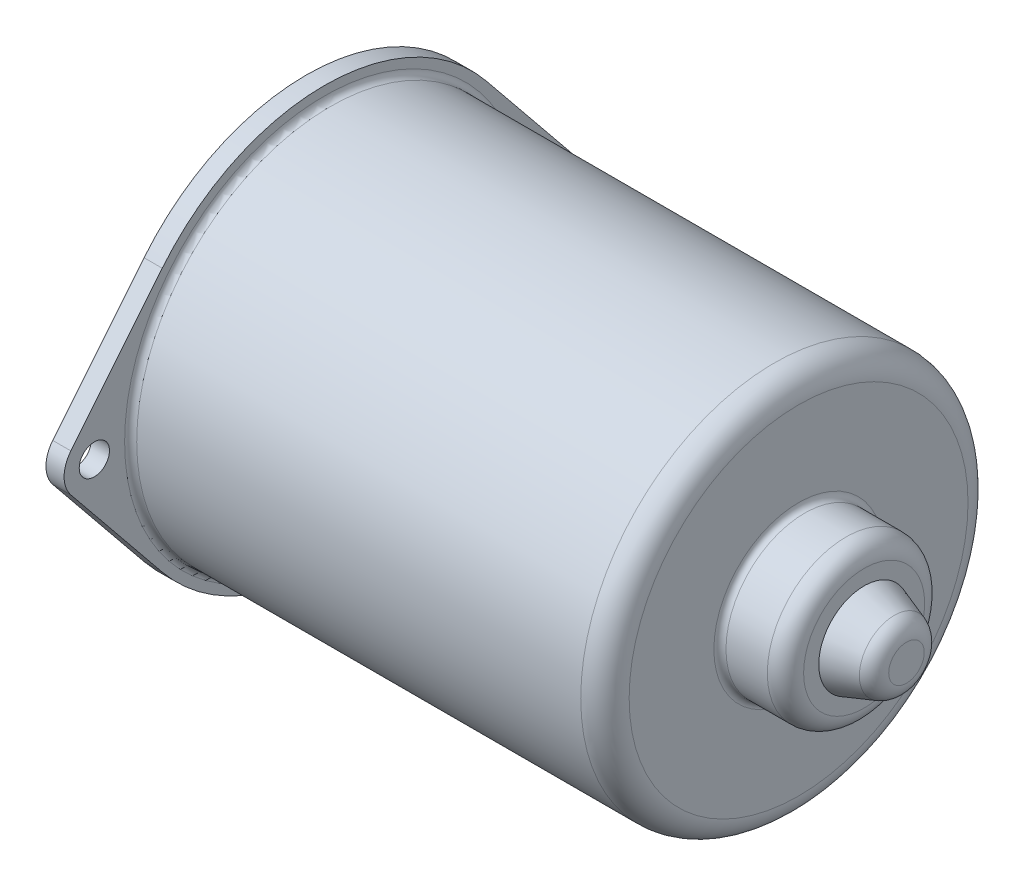
ISO-10303-21;
HEADER;
FILE_DESCRIPTION(('STEP AP214'),'2;1');
FILE_NAME('part.step','',(''),(''),'','','');
FILE_SCHEMA(('AUTOMOTIVE_DESIGN { 1 0 10303 214 1 1 1 1 }'));
ENDSEC;
DATA;
#1=APPLICATION_CONTEXT('core data for automotive mechanical design processes');
#2=APPLICATION_PROTOCOL_DEFINITION('international standard','automotive_design',2000,#1);
#3=PRODUCT_CONTEXT('',#1,'mechanical');
#4=PRODUCT('Part','Part','',(#3));
#5=PRODUCT_RELATED_PRODUCT_CATEGORY('part','',(#4));
#6=PRODUCT_DEFINITION_FORMATION('','',#4);
#7=PRODUCT_DEFINITION_CONTEXT('part definition',#1,'design');
#8=PRODUCT_DEFINITION('design','',#6,#7);
#9=PRODUCT_DEFINITION_SHAPE('','',#8);
#10=(LENGTH_UNIT() NAMED_UNIT(*) SI_UNIT(.MILLI.,.METRE.));
#11=(NAMED_UNIT(*) PLANE_ANGLE_UNIT() SI_UNIT($,.RADIAN.));
#12=(NAMED_UNIT(*) SI_UNIT($,.STERADIAN.) SOLID_ANGLE_UNIT());
#13=UNCERTAINTY_MEASURE_WITH_UNIT(LENGTH_MEASURE(1.E-05),#10,'distance_accuracy_value','');
#14=(GEOMETRIC_REPRESENTATION_CONTEXT(3) GLOBAL_UNCERTAINTY_ASSIGNED_CONTEXT((#13)) GLOBAL_UNIT_ASSIGNED_CONTEXT((#10,
#11,#12)) REPRESENTATION_CONTEXT('',''));
#15=CARTESIAN_POINT('',(0.,0.,0.));
#16=DIRECTION('',(0.,0.,1.));
#17=DIRECTION('',(1.,0.,0.));
#18=AXIS2_PLACEMENT_3D('',#15,#16,#17);
#19=CARTESIAN_POINT('',(-40.8415641656417,45.,0.));
#20=DIRECTION('',(-1.,0.,0.));
#21=DIRECTION('',(0.,0.,1.));
#22=AXIS2_PLACEMENT_3D('',#19,#20,#21);
#23=PLANE('',#22);
#24=CARTESIAN_POINT('',(-40.8415641656417,0.,-38.));
#25=DIRECTION('',(-1.,0.,0.));
#26=DIRECTION('',(0.,0.,1.));
#27=AXIS2_PLACEMENT_3D('',#24,#25,#26);
#28=CIRCLE('',#27,2.5);
#29=CARTESIAN_POINT('',(-40.8415641656417,0.,-35.5));
#30=VERTEX_POINT('',#29);
#31=EDGE_CURVE('E291',#30,#30,#28,.T.);
#32=ORIENTED_EDGE('',*,*,#31,.T.);
#33=EDGE_LOOP('',(#32));
#34=FACE_BOUND('',#33,.T.);
#35=CARTESIAN_POINT('',(-40.8415641656417,0.,38.));
#36=DIRECTION('',(-1.,0.,0.));
#37=DIRECTION('',(0.,0.,1.));
#38=AXIS2_PLACEMENT_3D('',#35,#36,#37);
#39=CIRCLE('',#38,2.5);
#40=CARTESIAN_POINT('',(-40.8415641656417,0.,40.5));
#41=VERTEX_POINT('',#40);
#42=EDGE_CURVE('E295',#41,#41,#39,.T.);
#43=ORIENTED_EDGE('',*,*,#42,.T.);
#44=EDGE_LOOP('',(#43));
#45=FACE_BOUND('',#44,.T.);
#46=CARTESIAN_POINT('',(-40.8415641656417,0.,0.));
#47=DIRECTION('',(-1.,0.,0.));
#48=DIRECTION('',(0.,0.,1.));
#49=AXIS2_PLACEMENT_3D('',#46,#47,#48);
#50=CIRCLE('',#49,33.);
#51=CARTESIAN_POINT('',(-40.8415641656417,0.,33.));
#52=VERTEX_POINT('',#51);
#53=EDGE_CURVE('E11',#52,#52,#50,.T.);
#54=ORIENTED_EDGE('',*,*,#53,.T.);
#55=EDGE_LOOP('',(#54));
#56=FACE_BOUND('',#55,.T.);
#57=CARTESIAN_POINT('',(-40.8415641656417,0.,0.));
#58=DIRECTION('',(-1.,0.,0.));
#59=DIRECTION('',(0.,0.,1.));
#60=AXIS2_PLACEMENT_3D('',#57,#58,#59);
#61=CIRCLE('',#60,34.5);
#62=CARTESIAN_POINT('',(-40.8415641656417,21.7468744769274,26.7828947368421));
#63=VERTEX_POINT('',#62);
#64=CARTESIAN_POINT('',(-40.8415641656417,21.7468744769274,-26.7828947368421));
#65=VERTEX_POINT('',#64);
#66=EDGE_CURVE('E160',#63,#65,#61,.T.);
#67=ORIENTED_EDGE('',*,*,#66,.F.);
#68=DIRECTION('',(0.,0.776315789473684,-0.630344187737025));
#69=VECTOR('',#68,1.);
#70=CARTESIAN_POINT('',(-40.8415641656417,48.8668537013041,4.76231817839733));
#71=LINE('',#70,#69);
#72=CARTESIAN_POINT('',(-40.8415641656417,3.15172093868512,41.8815789473684));
#73=VERTEX_POINT('',#72);
#74=EDGE_CURVE('E158',#73,#63,#71,.T.);
#75=ORIENTED_EDGE('',*,*,#74,.F.);
#76=CARTESIAN_POINT('',(-40.8415641656417,0.,38.));
#77=DIRECTION('',(-1.,0.,0.));
#78=DIRECTION('',(0.,0.,1.));
#79=AXIS2_PLACEMENT_3D('',#76,#77,#78);
#80=CIRCLE('',#79,4.99999999999999);
#81=CARTESIAN_POINT('',(-40.8415641656417,-3.15172093868513,41.8815789473684));
#82=VERTEX_POINT('',#81);
#83=EDGE_CURVE('E156',#82,#73,#80,.T.);
#84=ORIENTED_EDGE('',*,*,#83,.F.);
#85=DIRECTION('',(0.,0.776315789473684,0.630344187737025));
#86=VECTOR('',#85,1.);
#87=CARTESIAN_POINT('',(-40.8415641656417,5.37310474744936,48.8034712952869));
#88=LINE('',#87,#86);
#89=CARTESIAN_POINT('',(-40.8415641656417,-21.7468744769274,26.7828947368421));
#90=VERTEX_POINT('',#89);
#91=EDGE_CURVE('E154',#90,#82,#88,.T.);
#92=ORIENTED_EDGE('',*,*,#91,.F.);
#93=CARTESIAN_POINT('',(-40.8415641656417,0.,0.));
#94=DIRECTION('',(-1.,0.,0.));
#95=DIRECTION('',(0.,0.,1.));
#96=AXIS2_PLACEMENT_3D('',#93,#94,#95);
#97=CIRCLE('',#96,34.5);
#98=CARTESIAN_POINT('',(-40.8415641656417,-21.7468744769274,-26.7828947368421));
#99=VERTEX_POINT('',#98);
#100=EDGE_CURVE('E152',#99,#90,#97,.T.);
#101=ORIENTED_EDGE('',*,*,#100,.F.);
#102=DIRECTION('',(0.,-0.776315789473684,0.630344187737025));
#103=VECTOR('',#102,1.);
#104=CARTESIAN_POINT('',(-40.8415641656417,5.37310474744936,-48.8034712952869));
#105=LINE('',#104,#103);
#106=CARTESIAN_POINT('',(-40.8415641656417,-3.15172093868513,-41.8815789473684));
#107=VERTEX_POINT('',#106);
#108=EDGE_CURVE('E150',#107,#99,#105,.T.);
#109=ORIENTED_EDGE('',*,*,#108,.F.);
#110=CARTESIAN_POINT('',(-40.8415641656417,0.,-38.));
#111=DIRECTION('',(-1.,0.,0.));
#112=DIRECTION('',(0.,0.,1.));
#113=AXIS2_PLACEMENT_3D('',#110,#111,#112);
#114=CIRCLE('',#113,4.99999999999999);
#115=CARTESIAN_POINT('',(-40.8415641656417,3.15172093868512,-41.8815789473684));
#116=VERTEX_POINT('',#115);
#117=EDGE_CURVE('E102',#116,#107,#114,.T.);
#118=ORIENTED_EDGE('',*,*,#117,.F.);
#119=DIRECTION('',(0.,-0.776315789473684,-0.630344187737026));
#120=VECTOR('',#119,1.);
#121=CARTESIAN_POINT('',(-40.8415641656417,48.8668537013041,-4.76231817839731));
#122=LINE('',#121,#120);
#123=EDGE_CURVE('E138',#65,#116,#122,.T.);
#124=ORIENTED_EDGE('',*,*,#123,.F.);
#125=EDGE_LOOP('',(#67,#75,#84,#92,#101,#109,#118,#124));
#126=FACE_BOUND('',#125,.T.);
#127=ADVANCED_FACE('F35',(#34,#45,#56,#126),#23,.F.);
#128=CARTESIAN_POINT('',(-39.8415641656417,0.,0.));
#129=DIRECTION('',(-1.,0.,0.));
#130=DIRECTION('',(0.,0.,1.));
#131=AXIS2_PLACEMENT_3D('',#128,#129,#130);
#132=TOROIDAL_SURFACE('',#131,33.,1.);
#133=ORIENTED_EDGE('',*,*,#53,.F.);
#134=EDGE_LOOP('',(#133));
#135=FACE_BOUND('',#134,.T.);
#136=CARTESIAN_POINT('',(-39.8415641656417,0.,0.));
#137=DIRECTION('',(-1.,0.,0.));
#138=DIRECTION('',(0.,0.,1.));
#139=AXIS2_PLACEMENT_3D('',#136,#137,#138);
#140=CIRCLE('',#139,32.);
#141=CARTESIAN_POINT('',(-39.8415641656417,0.,32.));
#142=VERTEX_POINT('',#141);
#143=EDGE_CURVE('E42',#142,#142,#140,.T.);
#144=ORIENTED_EDGE('',*,*,#143,.T.);
#145=EDGE_LOOP('',(#144));
#146=FACE_BOUND('',#145,.T.);
#147=ADVANCED_FACE('F215',(#135,#146),#132,.F.);
#148=CARTESIAN_POINT('',(-73.1632533825338,0.,0.));
#149=DIRECTION('',(-1.,0.,0.));
#150=DIRECTION('',(0.,0.,1.));
#151=AXIS2_PLACEMENT_3D('',#148,#149,#150);
#152=CYLINDRICAL_SURFACE('',#151,32.);
#153=ORIENTED_EDGE('',*,*,#143,.F.);
#154=EDGE_LOOP('',(#153));
#155=FACE_BOUND('',#154,.T.);
#156=CARTESIAN_POINT('',(33.5375666256662,0.,0.));
#157=DIRECTION('',(-1.,0.,0.));
#158=DIRECTION('',(0.,0.,1.));
#159=AXIS2_PLACEMENT_3D('',#156,#157,#158);
#160=CIRCLE('',#159,32.);
#161=CARTESIAN_POINT('',(33.5375666256662,0.,32.));
#162=VERTEX_POINT('',#161);
#163=EDGE_CURVE('E210',#162,#162,#160,.T.);
#164=ORIENTED_EDGE('',*,*,#163,.T.);
#165=EDGE_LOOP('',(#164));
#166=FACE_BOUND('',#165,.T.);
#167=ADVANCED_FACE('F217',(#155,#166),#152,.T.);
#168=CARTESIAN_POINT('',(33.5375666256663,0.,0.));
#169=DIRECTION('',(-1.,0.,0.));
#170=DIRECTION('',(0.,0.,1.));
#171=AXIS2_PLACEMENT_3D('',#168,#169,#170);
#172=TOROIDAL_SURFACE('',#171,28.,4.);
#173=ORIENTED_EDGE('',*,*,#163,.F.);
#174=EDGE_LOOP('',(#173));
#175=FACE_BOUND('',#174,.T.);
#176=CARTESIAN_POINT('',(37.5375666256663,0.,0.));
#177=DIRECTION('',(-1.,0.,0.));
#178=DIRECTION('',(0.,0.,1.));
#179=AXIS2_PLACEMENT_3D('',#176,#177,#178);
#180=CIRCLE('',#179,28.);
#181=CARTESIAN_POINT('',(37.5375666256663,0.,28.));
#182=VERTEX_POINT('',#181);
#183=EDGE_CURVE('E207',#182,#182,#180,.T.);
#184=ORIENTED_EDGE('',*,*,#183,.T.);
#185=EDGE_LOOP('',(#184));
#186=FACE_BOUND('',#185,.T.);
#187=ADVANCED_FACE('F220',(#175,#186),#172,.T.);
#188=CARTESIAN_POINT('',(37.5375666256663,28.,0.));
#189=DIRECTION('',(-1.,0.,0.));
#190=DIRECTION('',(0.,0.,1.));
#191=AXIS2_PLACEMENT_3D('',#188,#189,#190);
#192=PLANE('',#191);
#193=ORIENTED_EDGE('',*,*,#183,.F.);
#194=EDGE_LOOP('',(#193));
#195=FACE_BOUND('',#194,.T.);
#196=CARTESIAN_POINT('',(37.5375666256663,0.,0.));
#197=DIRECTION('',(-1.,0.,0.));
#198=DIRECTION('',(0.,0.,1.));
#199=AXIS2_PLACEMENT_3D('',#196,#197,#198);
#200=CIRCLE('',#199,14.);
#201=CARTESIAN_POINT('',(37.5375666256663,0.,14.));
#202=VERTEX_POINT('',#201);
#203=EDGE_CURVE('E204',#202,#202,#200,.T.);
#204=ORIENTED_EDGE('',*,*,#203,.T.);
#205=EDGE_LOOP('',(#204));
#206=FACE_BOUND('',#205,.T.);
#207=ADVANCED_FACE('F226',(#195,#206),#192,.F.);
#208=CARTESIAN_POINT('',(38.5375666256663,0.,0.));
#209=DIRECTION('',(-1.,0.,0.));
#210=DIRECTION('',(0.,0.,1.));
#211=AXIS2_PLACEMENT_3D('',#208,#209,#210);
#212=TOROIDAL_SURFACE('',#211,14.,1.);
#213=ORIENTED_EDGE('',*,*,#203,.F.);
#214=EDGE_LOOP('',(#213));
#215=FACE_BOUND('',#214,.T.);
#216=CARTESIAN_POINT('',(38.5375666256663,0.,0.));
#217=DIRECTION('',(-1.,0.,0.));
#218=DIRECTION('',(0.,0.,1.));
#219=AXIS2_PLACEMENT_3D('',#216,#217,#218);
#220=CIRCLE('',#219,13.);
#221=CARTESIAN_POINT('',(38.5375666256663,0.,13.));
#222=VERTEX_POINT('',#221);
#223=EDGE_CURVE('E201',#222,#222,#220,.T.);
#224=ORIENTED_EDGE('',*,*,#223,.T.);
#225=EDGE_LOOP('',(#224));
#226=FACE_BOUND('',#225,.T.);
#227=ADVANCED_FACE('F232',(#215,#226),#212,.F.);
#228=CARTESIAN_POINT('',(-73.1632533825338,0.,0.));
#229=DIRECTION('',(-1.,0.,0.));
#230=DIRECTION('',(0.,0.,1.));
#231=AXIS2_PLACEMENT_3D('',#228,#229,#230);
#232=CYLINDRICAL_SURFACE('',#231,13.);
#233=ORIENTED_EDGE('',*,*,#223,.F.);
#234=EDGE_LOOP('',(#233));
#235=FACE_BOUND('',#234,.T.);
#236=CARTESIAN_POINT('',(45.3702849528495,0.,0.));
#237=DIRECTION('',(-1.,0.,0.));
#238=DIRECTION('',(0.,0.,1.));
#239=AXIS2_PLACEMENT_3D('',#236,#237,#238);
#240=CIRCLE('',#239,13.);
#241=CARTESIAN_POINT('',(45.3702849528495,0.,13.));
#242=VERTEX_POINT('',#241);
#243=EDGE_CURVE('E198',#242,#242,#240,.T.);
#244=ORIENTED_EDGE('',*,*,#243,.T.);
#245=EDGE_LOOP('',(#244));
#246=FACE_BOUND('',#245,.T.);
#247=ADVANCED_FACE('F238',(#235,#246),#232,.T.);
#248=CARTESIAN_POINT('',(45.3702849528495,0.,0.));
#249=DIRECTION('',(-1.,0.,0.));
#250=DIRECTION('',(0.,0.,1.));
#251=AXIS2_PLACEMENT_3D('',#248,#249,#250);
#252=TOROIDAL_SURFACE('',#251,10.,3.);
#253=ORIENTED_EDGE('',*,*,#243,.F.);
#254=EDGE_LOOP('',(#253));
#255=FACE_BOUND('',#254,.T.);
#256=CARTESIAN_POINT('',(48.3702849528495,0.,0.));
#257=DIRECTION('',(-1.,0.,0.));
#258=DIRECTION('',(0.,0.,1.));
#259=AXIS2_PLACEMENT_3D('',#256,#257,#258);
#260=CIRCLE('',#259,9.99999999999998);
#261=CARTESIAN_POINT('',(48.3702849528495,0.,9.99999999999998));
#262=VERTEX_POINT('',#261);
#263=EDGE_CURVE('E195',#262,#262,#260,.T.);
#264=ORIENTED_EDGE('',*,*,#263,.T.);
#265=EDGE_LOOP('',(#264));
#266=FACE_BOUND('',#265,.T.);
#267=ADVANCED_FACE('F244',(#255,#266),#252,.T.);
#268=CARTESIAN_POINT('',(48.3702849528495,9.99999999999998,0.));
#269=DIRECTION('',(-1.,0.,0.));
#270=DIRECTION('',(0.,0.,1.));
#271=AXIS2_PLACEMENT_3D('',#268,#269,#270);
#272=PLANE('',#271);
#273=ORIENTED_EDGE('',*,*,#263,.F.);
#274=EDGE_LOOP('',(#273));
#275=FACE_BOUND('',#274,.T.);
#276=CARTESIAN_POINT('',(48.3702849528495,0.,0.));
#277=DIRECTION('',(-1.,0.,0.));
#278=DIRECTION('',(0.,0.,1.));
#279=AXIS2_PLACEMENT_3D('',#276,#277,#278);
#280=CIRCLE('',#279,7.5);
#281=CARTESIAN_POINT('',(48.3702849528495,0.,7.5));
#282=VERTEX_POINT('',#281);
#283=EDGE_CURVE('E192',#282,#282,#280,.T.);
#284=ORIENTED_EDGE('',*,*,#283,.T.);
#285=EDGE_LOOP('',(#284));
#286=FACE_BOUND('',#285,.T.);
#287=ADVANCED_FACE('F250',(#275,#286),#272,.F.);
#288=CARTESIAN_POINT('',(53.3535577599262,0.,0.));
#289=DIRECTION('',(-1.,0.,0.));
#290=DIRECTION('',(0.,0.,1.));
#291=AXIS2_PLACEMENT_3D('',#288,#289,#290);
#292=CONICAL_SURFACE('',#291,5.77119866626494,0.333929089217263);
#293=ORIENTED_EDGE('',*,*,#283,.F.);
#294=EDGE_LOOP('',(#293));
#295=FACE_BOUND('',#294,.T.);
#296=CARTESIAN_POINT('',(53.3535577599262,0.,0.));
#297=DIRECTION('',(-1.,0.,0.));
#298=DIRECTION('',(0.,0.,1.));
#299=AXIS2_PLACEMENT_3D('',#296,#297,#298);
#300=CIRCLE('',#299,5.77119866626494);
#301=CARTESIAN_POINT('',(53.3535577599262,0.,5.77119866626494));
#302=VERTEX_POINT('',#301);
#303=EDGE_CURVE('E189',#302,#302,#300,.T.);
#304=ORIENTED_EDGE('',*,*,#303,.T.);
#305=EDGE_LOOP('',(#304));
#306=FACE_BOUND('',#305,.T.);
#307=ADVANCED_FACE('F256',(#295,#306),#292,.T.);
#308=CARTESIAN_POINT('',(52.3702849528495,0.,0.));
#309=DIRECTION('',(-1.,0.,0.));
#310=DIRECTION('',(0.,0.,1.));
#311=AXIS2_PLACEMENT_3D('',#308,#309,#310);
#312=DEGENERATE_TOROIDAL_SURFACE('',#311,2.93691311486691,3.,.T.);
#313=ORIENTED_EDGE('',*,*,#303,.F.);
#314=EDGE_LOOP('',(#313));
#315=FACE_BOUND('',#314,.T.);
#316=CARTESIAN_POINT('',(55.3702849528495,0.,0.));
#317=DIRECTION('',(-1.,0.,0.));
#318=DIRECTION('',(0.,0.,1.));
#319=AXIS2_PLACEMENT_3D('',#316,#317,#318);
#320=CIRCLE('',#319,2.93691311486691);
#321=CARTESIAN_POINT('',(55.3702849528495,0.,2.93691311486691));
#322=VERTEX_POINT('',#321);
#323=EDGE_CURVE('E186',#322,#322,#320,.T.);
#324=ORIENTED_EDGE('',*,*,#323,.T.);
#325=EDGE_LOOP('',(#324));
#326=FACE_BOUND('',#325,.T.);
#327=ADVANCED_FACE('F262',(#315,#326),#312,.T.);
#328=CARTESIAN_POINT('',(55.3702849528495,2.93691311486691,0.));
#329=DIRECTION('',(-1.,0.,0.));
#330=DIRECTION('',(0.,0.,1.));
#331=AXIS2_PLACEMENT_3D('',#328,#329,#330);
#332=PLANE('',#331);
#333=ORIENTED_EDGE('',*,*,#323,.F.);
#334=EDGE_LOOP('',(#333));
#335=FACE_BOUND('',#334,.T.);
#336=ADVANCED_FACE('F268',(#335),#332,.F.);
#337=CARTESIAN_POINT('',(55.3702849528495,0.,0.));
#338=DIRECTION('',(-1.,0.,0.));
#339=DIRECTION('',(0.,0.,1.));
#340=AXIS2_PLACEMENT_3D('',#337,#338,#339);
#341=CYLINDRICAL_SURFACE('',#340,34.5);
#342=ORIENTED_EDGE('',*,*,#66,.T.);
#343=DIRECTION('',(-1.,0.,0.));
#344=VECTOR('',#343,1.);
#345=CARTESIAN_POINT('',(55.3702849528495,21.7468744769274,-26.7828947368421));
#346=LINE('',#345,#344);
#347=CARTESIAN_POINT('',(-43.8415641656417,21.7468744769274,-26.7828947368421));
#348=VERTEX_POINT('',#347);
#349=EDGE_CURVE('E49',#65,#348,#346,.T.);
#350=ORIENTED_EDGE('',*,*,#349,.T.);
#351=CARTESIAN_POINT('',(-43.8415641656417,0.,0.));
#352=DIRECTION('',(-1.,0.,0.));
#353=DIRECTION('',(0.,0.,1.));
#354=AXIS2_PLACEMENT_3D('',#351,#352,#353);
#355=CIRCLE('',#354,34.5);
#356=CARTESIAN_POINT('',(-43.8415641656417,21.7468744769274,26.7828947368421));
#357=VERTEX_POINT('',#356);
#358=EDGE_CURVE('E122',#357,#348,#355,.T.);
#359=ORIENTED_EDGE('',*,*,#358,.F.);
#360=DIRECTION('',(-1.,0.,0.));
#361=VECTOR('',#360,1.);
#362=CARTESIAN_POINT('',(55.3702849528495,21.7468744769274,26.7828947368421));
#363=LINE('',#362,#361);
#364=EDGE_CURVE('E136',#63,#357,#363,.T.);
#365=ORIENTED_EDGE('',*,*,#364,.F.);
#366=EDGE_LOOP('',(#342,#350,#359,#365));
#367=FACE_BOUND('',#366,.T.);
#368=ADVANCED_FACE('F273',(#367),#341,.T.);
#369=CARTESIAN_POINT('',(55.3702849528495,21.7468744769274,26.7828947368421));
#370=DIRECTION('',(0.,0.630344187737025,0.776315789473684));
#371=DIRECTION('',(0.,-0.776315789473684,0.630344187737025));
#372=AXIS2_PLACEMENT_3D('',#369,#370,#371);
#373=PLANE('',#372);
#374=ORIENTED_EDGE('',*,*,#74,.T.);
#375=ORIENTED_EDGE('',*,*,#364,.T.);
#376=DIRECTION('',(0.,0.776315789473684,-0.630344187737025));
#377=VECTOR('',#376,1.);
#378=CARTESIAN_POINT('',(-43.8415641656417,21.7468744769274,26.7828947368421));
#379=LINE('',#378,#377);
#380=CARTESIAN_POINT('',(-43.8415641656417,3.15172093868512,41.8815789473684));
#381=VERTEX_POINT('',#380);
#382=EDGE_CURVE('E133',#381,#357,#379,.T.);
#383=ORIENTED_EDGE('',*,*,#382,.F.);
#384=DIRECTION('',(-1.,0.,0.));
#385=VECTOR('',#384,1.);
#386=CARTESIAN_POINT('',(55.3702849528495,3.15172093868512,41.8815789473684));
#387=LINE('',#386,#385);
#388=EDGE_CURVE('E139',#73,#381,#387,.T.);
#389=ORIENTED_EDGE('',*,*,#388,.F.);
#390=EDGE_LOOP('',(#374,#375,#383,#389));
#391=FACE_BOUND('',#390,.T.);
#392=ADVANCED_FACE('F278',(#391),#373,.T.);
#393=CARTESIAN_POINT('',(55.3702849528495,0.,38.));
#394=DIRECTION('',(-1.,0.,0.));
#395=DIRECTION('',(0.,0.,1.));
#396=AXIS2_PLACEMENT_3D('',#393,#394,#395);
#397=CYLINDRICAL_SURFACE('',#396,4.99999999999999);
#398=ORIENTED_EDGE('',*,*,#83,.T.);
#399=ORIENTED_EDGE('',*,*,#388,.T.);
#400=CARTESIAN_POINT('',(-43.8415641656417,0.,38.));
#401=DIRECTION('',(-1.,0.,0.));
#402=DIRECTION('',(0.,0.,1.));
#403=AXIS2_PLACEMENT_3D('',#400,#401,#402);
#404=CIRCLE('',#403,4.99999999999999);
#405=CARTESIAN_POINT('',(-43.8415641656417,-3.15172093868513,41.8815789473684));
#406=VERTEX_POINT('',#405);
#407=EDGE_CURVE('E130',#406,#381,#404,.T.);
#408=ORIENTED_EDGE('',*,*,#407,.F.);
#409=DIRECTION('',(-1.,0.,0.));
#410=VECTOR('',#409,1.);
#411=CARTESIAN_POINT('',(55.3702849528495,-3.15172093868513,41.8815789473684));
#412=LINE('',#411,#410);
#413=EDGE_CURVE('E141',#82,#406,#412,.T.);
#414=ORIENTED_EDGE('',*,*,#413,.F.);
#415=EDGE_LOOP('',(#398,#399,#408,#414));
#416=FACE_BOUND('',#415,.T.);
#417=ADVANCED_FACE('F309',(#416),#397,.T.);
#418=CARTESIAN_POINT('',(55.3702849528495,-3.15172093868513,41.8815789473684));
#419=DIRECTION('',(0.,-0.630344187737025,0.776315789473684));
#420=DIRECTION('',(0.,-0.776315789473684,-0.630344187737025));
#421=AXIS2_PLACEMENT_3D('',#418,#419,#420);
#422=PLANE('',#421);
#423=ORIENTED_EDGE('',*,*,#91,.T.);
#424=ORIENTED_EDGE('',*,*,#413,.T.);
#425=DIRECTION('',(0.,0.776315789473684,0.630344187737025));
#426=VECTOR('',#425,1.);
#427=CARTESIAN_POINT('',(-43.8415641656417,-3.15172093868513,41.8815789473684));
#428=LINE('',#427,#426);
#429=CARTESIAN_POINT('',(-43.8415641656417,-21.7468744769274,26.7828947368421));
#430=VERTEX_POINT('',#429);
#431=EDGE_CURVE('E127',#430,#406,#428,.T.);
#432=ORIENTED_EDGE('',*,*,#431,.F.);
#433=DIRECTION('',(-1.,0.,0.));
#434=VECTOR('',#433,1.);
#435=CARTESIAN_POINT('',(55.3702849528495,-21.7468744769274,26.7828947368421));
#436=LINE('',#435,#434);
#437=EDGE_CURVE('E143',#90,#430,#436,.T.);
#438=ORIENTED_EDGE('',*,*,#437,.F.);
#439=EDGE_LOOP('',(#423,#424,#432,#438));
#440=FACE_BOUND('',#439,.T.);
#441=ADVANCED_FACE('F315',(#440),#422,.T.);
#442=CARTESIAN_POINT('',(55.3702849528495,0.,0.));
#443=DIRECTION('',(-1.,0.,0.));
#444=DIRECTION('',(0.,0.,1.));
#445=AXIS2_PLACEMENT_3D('',#442,#443,#444);
#446=CYLINDRICAL_SURFACE('',#445,34.5);
#447=ORIENTED_EDGE('',*,*,#100,.T.);
#448=ORIENTED_EDGE('',*,*,#437,.T.);
#449=CARTESIAN_POINT('',(-43.8415641656417,0.,0.));
#450=DIRECTION('',(-1.,0.,0.));
#451=DIRECTION('',(0.,0.,1.));
#452=AXIS2_PLACEMENT_3D('',#449,#450,#451);
#453=CIRCLE('',#452,34.5);
#454=CARTESIAN_POINT('',(-43.8415641656417,-21.7468744769274,-26.7828947368421));
#455=VERTEX_POINT('',#454);
#456=EDGE_CURVE('E115',#455,#430,#453,.T.);
#457=ORIENTED_EDGE('',*,*,#456,.F.);
#458=DIRECTION('',(-1.,0.,0.));
#459=VECTOR('',#458,1.);
#460=CARTESIAN_POINT('',(55.3702849528495,-21.7468744769274,-26.7828947368421));
#461=LINE('',#460,#459);
#462=EDGE_CURVE('E105',#99,#455,#461,.T.);
#463=ORIENTED_EDGE('',*,*,#462,.F.);
#464=EDGE_LOOP('',(#447,#448,#457,#463));
#465=FACE_BOUND('',#464,.T.);
#466=ADVANCED_FACE('F318',(#465),#446,.T.);
#467=CARTESIAN_POINT('',(55.3702849528495,-21.7468744769274,-26.7828947368421));
#468=DIRECTION('',(0.,-0.630344187737025,-0.776315789473684));
#469=DIRECTION('',(0.,0.776315789473684,-0.630344187737025));
#470=AXIS2_PLACEMENT_3D('',#467,#468,#469);
#471=PLANE('',#470);
#472=ORIENTED_EDGE('',*,*,#108,.T.);
#473=ORIENTED_EDGE('',*,*,#462,.T.);
#474=DIRECTION('',(0.,-0.776315789473684,0.630344187737025));
#475=VECTOR('',#474,1.);
#476=CARTESIAN_POINT('',(-43.8415641656417,-21.7468744769274,-26.7828947368421));
#477=LINE('',#476,#475);
#478=CARTESIAN_POINT('',(-43.8415641656417,-3.15172093868513,-41.8815789473684));
#479=VERTEX_POINT('',#478);
#480=EDGE_CURVE('E109',#479,#455,#477,.T.);
#481=ORIENTED_EDGE('',*,*,#480,.F.);
#482=DIRECTION('',(-1.,0.,0.));
#483=VECTOR('',#482,1.);
#484=CARTESIAN_POINT('',(55.3702849528495,-3.15172093868513,-41.8815789473684));
#485=LINE('',#484,#483);
#486=EDGE_CURVE('E98',#107,#479,#485,.T.);
#487=ORIENTED_EDGE('',*,*,#486,.F.);
#488=EDGE_LOOP('',(#472,#473,#481,#487));
#489=FACE_BOUND('',#488,.T.);
#490=ADVANCED_FACE('F110',(#489),#471,.T.);
#491=CARTESIAN_POINT('',(55.3702849528495,0.,-38.));
#492=DIRECTION('',(-1.,0.,0.));
#493=DIRECTION('',(0.,0.,1.));
#494=AXIS2_PLACEMENT_3D('',#491,#492,#493);
#495=CYLINDRICAL_SURFACE('',#494,4.99999999999999);
#496=ORIENTED_EDGE('',*,*,#117,.T.);
#497=ORIENTED_EDGE('',*,*,#486,.T.);
#498=CARTESIAN_POINT('',(-43.8415641656417,0.,-38.));
#499=DIRECTION('',(-1.,0.,0.));
#500=DIRECTION('',(0.,0.,1.));
#501=AXIS2_PLACEMENT_3D('',#498,#499,#500);
#502=CIRCLE('',#501,4.99999999999999);
#503=CARTESIAN_POINT('',(-43.8415641656417,3.15172093868512,-41.8815789473684));
#504=VERTEX_POINT('',#503);
#505=EDGE_CURVE('E57',#504,#479,#502,.T.);
#506=ORIENTED_EDGE('',*,*,#505,.F.);
#507=DIRECTION('',(-1.,0.,0.));
#508=VECTOR('',#507,1.);
#509=CARTESIAN_POINT('',(55.3702849528495,3.15172093868512,-41.8815789473684));
#510=LINE('',#509,#508);
#511=EDGE_CURVE('E106',#116,#504,#510,.T.);
#512=ORIENTED_EDGE('',*,*,#511,.F.);
#513=EDGE_LOOP('',(#496,#497,#506,#512));
#514=FACE_BOUND('',#513,.T.);
#515=ADVANCED_FACE('F100',(#514),#495,.T.);
#516=CARTESIAN_POINT('',(55.3702849528495,3.15172093868512,-41.8815789473684));
#517=DIRECTION('',(0.,0.630344187737026,-0.776315789473684));
#518=DIRECTION('',(0.,0.776315789473684,0.630344187737026));
#519=AXIS2_PLACEMENT_3D('',#516,#517,#518);
#520=PLANE('',#519);
#521=ORIENTED_EDGE('',*,*,#123,.T.);
#522=ORIENTED_EDGE('',*,*,#511,.T.);
#523=DIRECTION('',(0.,-0.776315789473684,-0.630344187737026));
#524=VECTOR('',#523,1.);
#525=CARTESIAN_POINT('',(-43.8415641656417,3.15172093868512,-41.8815789473684));
#526=LINE('',#525,#524);
#527=EDGE_CURVE('E120',#348,#504,#526,.T.);
#528=ORIENTED_EDGE('',*,*,#527,.F.);
#529=ORIENTED_EDGE('',*,*,#349,.F.);
#530=EDGE_LOOP('',(#521,#522,#528,#529));
#531=FACE_BOUND('',#530,.T.);
#532=ADVANCED_FACE('F373',(#531),#520,.T.);
#533=CARTESIAN_POINT('',(52.3702849528495,2.93691311486691,0.));
#534=DIRECTION('',(1.,0.,0.));
#535=DIRECTION('',(0.,0.,-1.));
#536=AXIS2_PLACEMENT_3D('',#533,#534,#535);
#537=PLANE('',#536);
#538=CARTESIAN_POINT('',(52.3702849528495,0.,0.));
#539=DIRECTION('',(-1.,0.,0.));
#540=DIRECTION('',(0.,0.,1.));
#541=AXIS2_PLACEMENT_3D('',#538,#539,#540);
#542=CIRCLE('',#541,2.93691311486691);
#543=CARTESIAN_POINT('',(52.3702849528495,0.,2.93691311486691));
#544=VERTEX_POINT('',#543);
#545=EDGE_CURVE('E183',#544,#544,#542,.T.);
#546=ORIENTED_EDGE('',*,*,#545,.T.);
#547=EDGE_LOOP('',(#546));
#548=FACE_BOUND('',#547,.T.);
#549=ADVANCED_FACE('F370',(#548),#537,.F.);
#550=CARTESIAN_POINT('',(45.3702849528495,0.,0.));
#551=DIRECTION('',(-1.,0.,0.));
#552=DIRECTION('',(0.,0.,1.));
#553=AXIS2_PLACEMENT_3D('',#550,#551,#552);
#554=CONICAL_SURFACE('',#553,5.36535919932775,0.333929089217264);
#555=ORIENTED_EDGE('',*,*,#545,.F.);
#556=EDGE_LOOP('',(#555));
#557=FACE_BOUND('',#556,.T.);
#558=CARTESIAN_POINT('',(45.3702849528495,0.,0.));
#559=DIRECTION('',(-1.,0.,0.));
#560=DIRECTION('',(0.,0.,1.));
#561=AXIS2_PLACEMENT_3D('',#558,#559,#560);
#562=CIRCLE('',#561,5.36535919932775);
#563=CARTESIAN_POINT('',(45.3702849528495,0.,5.36535919932775));
#564=VERTEX_POINT('',#563);
#565=EDGE_CURVE('E180',#564,#564,#562,.T.);
#566=ORIENTED_EDGE('',*,*,#565,.T.);
#567=EDGE_LOOP('',(#566));
#568=FACE_BOUND('',#567,.T.);
#569=ADVANCED_FACE('F367',(#557,#568),#554,.F.);
#570=CARTESIAN_POINT('',(45.3702849528495,10.,0.));
#571=DIRECTION('',(1.,0.,0.));
#572=DIRECTION('',(0.,0.,-1.));
#573=AXIS2_PLACEMENT_3D('',#570,#571,#572);
#574=PLANE('',#573);
#575=ORIENTED_EDGE('',*,*,#565,.F.);
#576=EDGE_LOOP('',(#575));
#577=FACE_BOUND('',#576,.T.);
#578=CARTESIAN_POINT('',(45.3702849528495,0.,0.));
#579=DIRECTION('',(-1.,0.,0.));
#580=DIRECTION('',(0.,0.,1.));
#581=AXIS2_PLACEMENT_3D('',#578,#579,#580);
#582=CIRCLE('',#581,10.);
#583=CARTESIAN_POINT('',(45.3702849528495,0.,10.));
#584=VERTEX_POINT('',#583);
#585=EDGE_CURVE('E177',#584,#584,#582,.T.);
#586=ORIENTED_EDGE('',*,*,#585,.T.);
#587=EDGE_LOOP('',(#586));
#588=FACE_BOUND('',#587,.T.);
#589=ADVANCED_FACE('F363',(#577,#588),#574,.F.);
#590=CARTESIAN_POINT('',(-73.1632533825338,0.,0.));
#591=DIRECTION('',(-1.,0.,0.));
#592=DIRECTION('',(0.,0.,1.));
#593=AXIS2_PLACEMENT_3D('',#590,#591,#592);
#594=CYLINDRICAL_SURFACE('',#593,10.);
#595=ORIENTED_EDGE('',*,*,#585,.F.);
#596=EDGE_LOOP('',(#595));
#597=FACE_BOUND('',#596,.T.);
#598=CARTESIAN_POINT('',(38.5375666256663,0.,0.));
#599=DIRECTION('',(-1.,0.,0.));
#600=DIRECTION('',(0.,0.,1.));
#601=AXIS2_PLACEMENT_3D('',#598,#599,#600);
#602=CIRCLE('',#601,10.);
#603=CARTESIAN_POINT('',(38.5375666256663,0.,10.));
#604=VERTEX_POINT('',#603);
#605=EDGE_CURVE('E174',#604,#604,#602,.T.);
#606=ORIENTED_EDGE('',*,*,#605,.T.);
#607=EDGE_LOOP('',(#606));
#608=FACE_BOUND('',#607,.T.);
#609=ADVANCED_FACE('F359',(#597,#608),#594,.F.);
#610=CARTESIAN_POINT('',(38.5375666256663,0.,0.));
#611=DIRECTION('',(-1.,0.,0.));
#612=DIRECTION('',(0.,0.,1.));
#613=AXIS2_PLACEMENT_3D('',#610,#611,#612);
#614=TOROIDAL_SURFACE('',#613,14.,4.);
#615=ORIENTED_EDGE('',*,*,#605,.F.);
#616=EDGE_LOOP('',(#615));
#617=FACE_BOUND('',#616,.T.);
#618=CARTESIAN_POINT('',(34.5375666256663,0.,0.));
#619=DIRECTION('',(-1.,0.,0.));
#620=DIRECTION('',(0.,0.,1.));
#621=AXIS2_PLACEMENT_3D('',#618,#619,#620);
#622=CIRCLE('',#621,14.);
#623=CARTESIAN_POINT('',(34.5375666256663,0.,14.));
#624=VERTEX_POINT('',#623);
#625=EDGE_CURVE('E171',#624,#624,#622,.T.);
#626=ORIENTED_EDGE('',*,*,#625,.T.);
#627=EDGE_LOOP('',(#626));
#628=FACE_BOUND('',#627,.T.);
#629=ADVANCED_FACE('F355',(#617,#628),#614,.T.);
#630=CARTESIAN_POINT('',(34.5375666256663,28.,0.));
#631=DIRECTION('',(1.,0.,0.));
#632=DIRECTION('',(0.,0.,-1.));
#633=AXIS2_PLACEMENT_3D('',#630,#631,#632);
#634=PLANE('',#633);
#635=ORIENTED_EDGE('',*,*,#625,.F.);
#636=EDGE_LOOP('',(#635));
#637=FACE_BOUND('',#636,.T.);
#638=CARTESIAN_POINT('',(34.5375666256663,0.,0.));
#639=DIRECTION('',(-1.,0.,0.));
#640=DIRECTION('',(0.,0.,1.));
#641=AXIS2_PLACEMENT_3D('',#638,#639,#640);
#642=CIRCLE('',#641,28.);
#643=CARTESIAN_POINT('',(34.5375666256663,0.,28.));
#644=VERTEX_POINT('',#643);
#645=EDGE_CURVE('E168',#644,#644,#642,.T.);
#646=ORIENTED_EDGE('',*,*,#645,.T.);
#647=EDGE_LOOP('',(#646));
#648=FACE_BOUND('',#647,.T.);
#649=ADVANCED_FACE('F348',(#637,#648),#634,.F.);
#650=CARTESIAN_POINT('',(33.5375666256663,0.,0.));
#651=DIRECTION('',(-1.,0.,0.));
#652=DIRECTION('',(0.,0.,1.));
#653=AXIS2_PLACEMENT_3D('',#650,#651,#652);
#654=TOROIDAL_SURFACE('',#653,28.,1.);
#655=ORIENTED_EDGE('',*,*,#645,.F.);
#656=EDGE_LOOP('',(#655));
#657=FACE_BOUND('',#656,.T.);
#658=CARTESIAN_POINT('',(33.5375666256663,0.,0.));
#659=DIRECTION('',(-1.,0.,0.));
#660=DIRECTION('',(0.,0.,1.));
#661=AXIS2_PLACEMENT_3D('',#658,#659,#660);
#662=CIRCLE('',#661,29.);
#663=CARTESIAN_POINT('',(33.5375666256663,0.,29.));
#664=VERTEX_POINT('',#663);
#665=EDGE_CURVE('E165',#664,#664,#662,.T.);
#666=ORIENTED_EDGE('',*,*,#665,.T.);
#667=EDGE_LOOP('',(#666));
#668=FACE_BOUND('',#667,.T.);
#669=ADVANCED_FACE('F342',(#657,#668),#654,.F.);
#670=CARTESIAN_POINT('',(-73.1632533825338,0.,0.));
#671=DIRECTION('',(-1.,0.,0.));
#672=DIRECTION('',(0.,0.,1.));
#673=AXIS2_PLACEMENT_3D('',#670,#671,#672);
#674=CYLINDRICAL_SURFACE('',#673,29.);
#675=ORIENTED_EDGE('',*,*,#665,.F.);
#676=EDGE_LOOP('',(#675));
#677=FACE_BOUND('',#676,.T.);
#678=CARTESIAN_POINT('',(-43.8415641656417,0.,0.));
#679=DIRECTION('',(-1.,0.,0.));
#680=DIRECTION('',(0.,0.,1.));
#681=AXIS2_PLACEMENT_3D('',#678,#679,#680);
#682=CIRCLE('',#681,29.);
#683=CARTESIAN_POINT('',(-43.8415641656417,0.,29.));
#684=VERTEX_POINT('',#683);
#685=EDGE_CURVE('E162',#684,#684,#682,.T.);
#686=ORIENTED_EDGE('',*,*,#685,.T.);
#687=EDGE_LOOP('',(#686));
#688=FACE_BOUND('',#687,.T.);
#689=ADVANCED_FACE('F335',(#677,#688),#674,.F.);
#690=CARTESIAN_POINT('',(-43.8415641656417,45.,0.));
#691=DIRECTION('',(1.,0.,0.));
#692=DIRECTION('',(0.,0.,-1.));
#693=AXIS2_PLACEMENT_3D('',#690,#691,#692);
#694=PLANE('',#693);
#695=CARTESIAN_POINT('',(-43.8415641656417,0.,-38.));
#696=DIRECTION('',(-1.,0.,0.));
#697=DIRECTION('',(0.,0.,1.));
#698=AXIS2_PLACEMENT_3D('',#695,#696,#697);
#699=CIRCLE('',#698,2.5);
#700=CARTESIAN_POINT('',(-43.8415641656417,0.,-35.5));
#701=VERTEX_POINT('',#700);
#702=EDGE_CURVE('E325',#701,#701,#699,.T.);
#703=ORIENTED_EDGE('',*,*,#702,.F.);
#704=EDGE_LOOP('',(#703));
#705=FACE_BOUND('',#704,.T.);
#706=CARTESIAN_POINT('',(-43.8415641656417,0.,38.));
#707=DIRECTION('',(-1.,0.,0.));
#708=DIRECTION('',(0.,0.,1.));
#709=AXIS2_PLACEMENT_3D('',#706,#707,#708);
#710=CIRCLE('',#709,2.5);
#711=CARTESIAN_POINT('',(-43.8415641656417,0.,40.5));
#712=VERTEX_POINT('',#711);
#713=EDGE_CURVE('E319',#712,#712,#710,.T.);
#714=ORIENTED_EDGE('',*,*,#713,.F.);
#715=EDGE_LOOP('',(#714));
#716=FACE_BOUND('',#715,.T.);
#717=ORIENTED_EDGE('',*,*,#685,.F.);
#718=EDGE_LOOP('',(#717));
#719=FACE_BOUND('',#718,.T.);
#720=ORIENTED_EDGE('',*,*,#358,.T.);
#721=ORIENTED_EDGE('',*,*,#527,.T.);
#722=ORIENTED_EDGE('',*,*,#505,.T.);
#723=ORIENTED_EDGE('',*,*,#480,.T.);
#724=ORIENTED_EDGE('',*,*,#456,.T.);
#725=ORIENTED_EDGE('',*,*,#431,.T.);
#726=ORIENTED_EDGE('',*,*,#407,.T.);
#727=ORIENTED_EDGE('',*,*,#382,.T.);
#728=EDGE_LOOP('',(#720,#721,#722,#723,#724,#725,#726,#727));
#729=FACE_BOUND('',#728,.T.);
#730=ADVANCED_FACE('F119',(#705,#716,#719,#729),#694,.F.);
#731=CARTESIAN_POINT('',(55.3702849528495,0.,38.));
#732=DIRECTION('',(-1.,0.,0.));
#733=DIRECTION('',(0.,0.,1.));
#734=AXIS2_PLACEMENT_3D('',#731,#732,#733);
#735=CYLINDRICAL_SURFACE('',#734,2.5);
#736=ORIENTED_EDGE('',*,*,#713,.T.);
#737=EDGE_LOOP('',(#736));
#738=FACE_BOUND('',#737,.T.);
#739=ORIENTED_EDGE('',*,*,#42,.F.);
#740=EDGE_LOOP('',(#739));
#741=FACE_BOUND('',#740,.T.);
#742=ADVANCED_FACE('F334',(#738,#741),#735,.F.);
#743=CARTESIAN_POINT('',(55.3702849528495,0.,-38.));
#744=DIRECTION('',(-1.,0.,0.));
#745=DIRECTION('',(0.,0.,1.));
#746=AXIS2_PLACEMENT_3D('',#743,#744,#745);
#747=CYLINDRICAL_SURFACE('',#746,2.5);
#748=ORIENTED_EDGE('',*,*,#702,.T.);
#749=EDGE_LOOP('',(#748));
#750=FACE_BOUND('',#749,.T.);
#751=ORIENTED_EDGE('',*,*,#31,.F.);
#752=EDGE_LOOP('',(#751));
#753=FACE_BOUND('',#752,.T.);
#754=ADVANCED_FACE('F329',(#750,#753),#747,.F.);
#755=CLOSED_SHELL('',(#127,#147,#167,#187,#207,#227,#247,#267,#287,#307,#327,#336,#368,#392,
#417,#441,#466,#490,#515,#532,#549,#569,#589,#609,#629,#649,#669,#689,#730,#742,#754));
#756=MANIFOLD_SOLID_BREP('B2',#755);
#757=ADVANCED_BREP_SHAPE_REPRESENTATION('',(#18,#756),#14);
#758=SHAPE_DEFINITION_REPRESENTATION(#9,#757);
ENDSEC;
END-ISO-10303-21;
